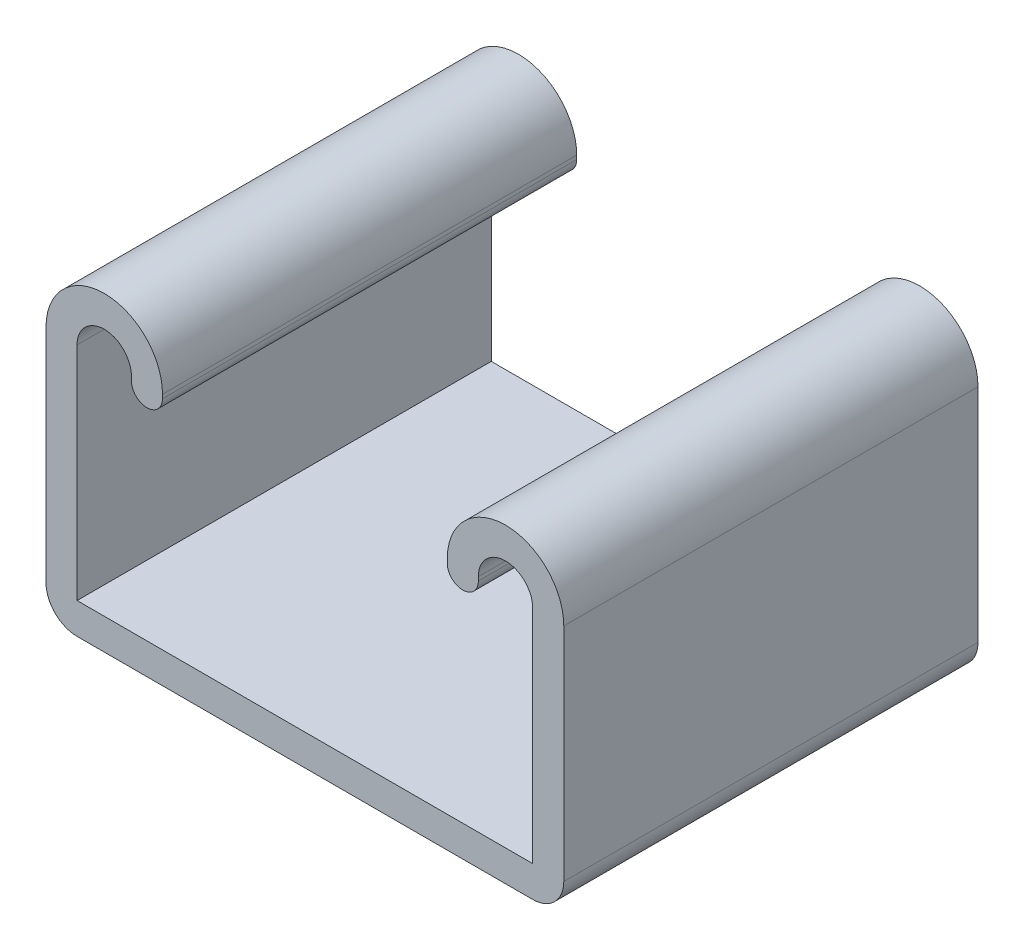
ISO-10303-21;
HEADER;
FILE_DESCRIPTION(('STEP AP214'),'2;1');
FILE_NAME('part.step','',(''),(''),'','','');
FILE_SCHEMA(('AUTOMOTIVE_DESIGN { 1 0 10303 214 1 1 1 1 }'));
ENDSEC;
DATA;
#1=APPLICATION_CONTEXT('core data for automotive mechanical design processes');
#2=APPLICATION_PROTOCOL_DEFINITION('international standard','automotive_design',2000,#1);
#3=PRODUCT_CONTEXT('',#1,'mechanical');
#4=PRODUCT('Part','Part','',(#3));
#5=PRODUCT_RELATED_PRODUCT_CATEGORY('part','',(#4));
#6=PRODUCT_DEFINITION_FORMATION('','',#4);
#7=PRODUCT_DEFINITION_CONTEXT('part definition',#1,'design');
#8=PRODUCT_DEFINITION('design','',#6,#7);
#9=PRODUCT_DEFINITION_SHAPE('','',#8);
#10=(LENGTH_UNIT() NAMED_UNIT(*) SI_UNIT(.MILLI.,.METRE.));
#11=(NAMED_UNIT(*) PLANE_ANGLE_UNIT() SI_UNIT($,.RADIAN.));
#12=(NAMED_UNIT(*) SI_UNIT($,.STERADIAN.) SOLID_ANGLE_UNIT());
#13=UNCERTAINTY_MEASURE_WITH_UNIT(LENGTH_MEASURE(1.E-05),#10,'distance_accuracy_value','');
#14=(GEOMETRIC_REPRESENTATION_CONTEXT(3) GLOBAL_UNCERTAINTY_ASSIGNED_CONTEXT((#13)) GLOBAL_UNIT_ASSIGNED_CONTEXT((#10,
#11,#12)) REPRESENTATION_CONTEXT('',''));
#15=CARTESIAN_POINT('',(0.,0.,0.));
#16=DIRECTION('',(0.,0.,1.));
#17=DIRECTION('',(1.,0.,0.));
#18=AXIS2_PLACEMENT_3D('',#15,#16,#17);
#19=CARTESIAN_POINT('',(-12.303125,7.604125,12.7));
#20=DIRECTION('',(0.,0.,-1.));
#21=DIRECTION('',(-1.,0.,0.));
#22=AXIS2_PLACEMENT_3D('',#19,#20,#21);
#23=CYLINDRICAL_SURFACE('',#22,3.571875);
#24=CARTESIAN_POINT('',(-12.303125,7.604125,-12.7));
#25=DIRECTION('',(0.,0.,1.));
#26=DIRECTION('',(-1.,0.,0.));
#27=AXIS2_PLACEMENT_3D('',#24,#25,#26);
#28=CIRCLE('',#27,3.571875);
#29=CARTESIAN_POINT('',(-8.73125,7.604125,-12.7));
#30=VERTEX_POINT('',#29);
#31=CARTESIAN_POINT('',(-15.875,7.604125,-12.7));
#32=VERTEX_POINT('',#31);
#33=EDGE_CURVE('E188',#30,#32,#28,.T.);
#34=ORIENTED_EDGE('',*,*,#33,.T.);
#35=DIRECTION('',(0.,0.,-1.));
#36=VECTOR('',#35,1.);
#37=CARTESIAN_POINT('',(-15.875,7.604125,12.7));
#38=LINE('',#37,#36);
#39=CARTESIAN_POINT('',(-15.875,7.604125,12.7));
#40=VERTEX_POINT('',#39);
#41=EDGE_CURVE('E11',#40,#32,#38,.T.);
#42=ORIENTED_EDGE('',*,*,#41,.F.);
#43=CARTESIAN_POINT('',(-12.303125,7.604125,12.7));
#44=DIRECTION('',(0.,0.,1.));
#45=DIRECTION('',(-1.,0.,0.));
#46=AXIS2_PLACEMENT_3D('',#43,#44,#45);
#47=CIRCLE('',#46,3.571875);
#48=CARTESIAN_POINT('',(-8.73125,7.604125,12.7));
#49=VERTEX_POINT('',#48);
#50=EDGE_CURVE('E222',#49,#40,#47,.T.);
#51=ORIENTED_EDGE('',*,*,#50,.F.);
#52=DIRECTION('',(0.,0.,-1.));
#53=VECTOR('',#52,1.);
#54=CARTESIAN_POINT('',(-8.73125,7.604125,12.7));
#55=LINE('',#54,#53);
#56=EDGE_CURVE('E184',#49,#30,#55,.T.);
#57=ORIENTED_EDGE('',*,*,#56,.T.);
#58=EDGE_LOOP('',(#34,#42,#51,#57));
#59=FACE_BOUND('',#58,.T.);
#60=ADVANCED_FACE('F32',(#59),#23,.T.);
#61=CARTESIAN_POINT('',(-15.875,7.604125,12.7));
#62=DIRECTION('',(1.,0.,0.));
#63=DIRECTION('',(0.,0.,-1.));
#64=AXIS2_PLACEMENT_3D('',#61,#62,#63);
#65=PLANE('',#64);
#66=DIRECTION('',(0.,-1.,0.));
#67=VECTOR('',#66,1.);
#68=CARTESIAN_POINT('',(-15.875,7.604125,-12.7));
#69=LINE('',#68,#67);
#70=CARTESIAN_POINT('',(-15.875,-5.969,-12.7));
#71=VERTEX_POINT('',#70);
#72=EDGE_CURVE('E191',#32,#71,#69,.T.);
#73=ORIENTED_EDGE('',*,*,#72,.T.);
#74=DIRECTION('',(0.,0.,-1.));
#75=VECTOR('',#74,1.);
#76=CARTESIAN_POINT('',(-15.875,-5.969,12.7));
#77=LINE('',#76,#75);
#78=CARTESIAN_POINT('',(-15.875,-5.969,12.7));
#79=VERTEX_POINT('',#78);
#80=EDGE_CURVE('E40',#79,#71,#77,.T.);
#81=ORIENTED_EDGE('',*,*,#80,.F.);
#82=DIRECTION('',(0.,-1.,0.));
#83=VECTOR('',#82,1.);
#84=CARTESIAN_POINT('',(-15.875,7.604125,12.7));
#85=LINE('',#84,#83);
#86=EDGE_CURVE('E121',#40,#79,#85,.T.);
#87=ORIENTED_EDGE('',*,*,#86,.F.);
#88=ORIENTED_EDGE('',*,*,#41,.T.);
#89=EDGE_LOOP('',(#73,#81,#87,#88));
#90=FACE_BOUND('',#89,.T.);
#91=ADVANCED_FACE('F330',(#90),#65,.F.);
#92=CARTESIAN_POINT('',(-13.97,-5.969,12.7));
#93=DIRECTION('',(0.,0.,-1.));
#94=DIRECTION('',(-1.,0.,0.));
#95=AXIS2_PLACEMENT_3D('',#92,#93,#94);
#96=CYLINDRICAL_SURFACE('',#95,1.905);
#97=CARTESIAN_POINT('',(-13.97,-5.969,-12.7));
#98=DIRECTION('',(0.,0.,1.));
#99=DIRECTION('',(-1.,0.,0.));
#100=AXIS2_PLACEMENT_3D('',#97,#98,#99);
#101=CIRCLE('',#100,1.905);
#102=CARTESIAN_POINT('',(-13.97,-7.874,-12.7));
#103=VERTEX_POINT('',#102);
#104=EDGE_CURVE('E193',#71,#103,#101,.T.);
#105=ORIENTED_EDGE('',*,*,#104,.T.);
#106=DIRECTION('',(0.,0.,-1.));
#107=VECTOR('',#106,1.);
#108=CARTESIAN_POINT('',(-13.97,-7.874,12.7));
#109=LINE('',#108,#107);
#110=CARTESIAN_POINT('',(-13.97,-7.874,12.7));
#111=VERTEX_POINT('',#110);
#112=EDGE_CURVE('E259',#111,#103,#109,.T.);
#113=ORIENTED_EDGE('',*,*,#112,.F.);
#114=CARTESIAN_POINT('',(-13.97,-5.969,12.7));
#115=DIRECTION('',(0.,0.,1.));
#116=DIRECTION('',(-1.,0.,0.));
#117=AXIS2_PLACEMENT_3D('',#114,#115,#116);
#118=CIRCLE('',#117,1.905);
#119=EDGE_CURVE('E267',#79,#111,#118,.T.);
#120=ORIENTED_EDGE('',*,*,#119,.F.);
#121=ORIENTED_EDGE('',*,*,#80,.T.);
#122=EDGE_LOOP('',(#105,#113,#120,#121));
#123=FACE_BOUND('',#122,.T.);
#124=ADVANCED_FACE('F265',(#123),#96,.T.);
#125=CARTESIAN_POINT('',(-13.97,-7.874,12.7));
#126=DIRECTION('',(0.,1.,0.));
#127=DIRECTION('',(0.,0.,1.));
#128=AXIS2_PLACEMENT_3D('',#125,#126,#127);
#129=PLANE('',#128);
#130=DIRECTION('',(1.,0.,0.));
#131=VECTOR('',#130,1.);
#132=CARTESIAN_POINT('',(-13.97,-7.874,-12.7));
#133=LINE('',#132,#131);
#134=CARTESIAN_POINT('',(13.97,-7.874,-12.7));
#135=VERTEX_POINT('',#134);
#136=EDGE_CURVE('E195',#103,#135,#133,.T.);
#137=ORIENTED_EDGE('',*,*,#136,.T.);
#138=DIRECTION('',(0.,0.,-1.));
#139=VECTOR('',#138,1.);
#140=CARTESIAN_POINT('',(13.97,-7.874,12.7));
#141=LINE('',#140,#139);
#142=CARTESIAN_POINT('',(13.97,-7.874,12.7));
#143=VERTEX_POINT('',#142);
#144=EDGE_CURVE('E256',#143,#135,#141,.T.);
#145=ORIENTED_EDGE('',*,*,#144,.F.);
#146=DIRECTION('',(1.,0.,0.));
#147=VECTOR('',#146,1.);
#148=CARTESIAN_POINT('',(-13.97,-7.874,12.7));
#149=LINE('',#148,#147);
#150=EDGE_CURVE('E285',#111,#143,#149,.T.);
#151=ORIENTED_EDGE('',*,*,#150,.F.);
#152=ORIENTED_EDGE('',*,*,#112,.T.);
#153=EDGE_LOOP('',(#137,#145,#151,#152));
#154=FACE_BOUND('',#153,.T.);
#155=ADVANCED_FACE('F276',(#154),#129,.F.);
#156=CARTESIAN_POINT('',(13.97,-5.969,12.7));
#157=DIRECTION('',(0.,0.,-1.));
#158=DIRECTION('',(-1.,0.,0.));
#159=AXIS2_PLACEMENT_3D('',#156,#157,#158);
#160=CYLINDRICAL_SURFACE('',#159,1.905);
#161=CARTESIAN_POINT('',(13.97,-5.969,-12.7));
#162=DIRECTION('',(0.,0.,1.));
#163=DIRECTION('',(1.,0.,0.));
#164=AXIS2_PLACEMENT_3D('',#161,#162,#163);
#165=CIRCLE('',#164,1.905);
#166=CARTESIAN_POINT('',(15.875,-5.969,-12.7));
#167=VERTEX_POINT('',#166);
#168=EDGE_CURVE('E197',#135,#167,#165,.T.);
#169=ORIENTED_EDGE('',*,*,#168,.T.);
#170=DIRECTION('',(0.,0.,-1.));
#171=VECTOR('',#170,1.);
#172=CARTESIAN_POINT('',(15.875,-5.969,12.7));
#173=LINE('',#172,#171);
#174=CARTESIAN_POINT('',(15.875,-5.969,12.7));
#175=VERTEX_POINT('',#174);
#176=EDGE_CURVE('E253',#175,#167,#173,.T.);
#177=ORIENTED_EDGE('',*,*,#176,.F.);
#178=CARTESIAN_POINT('',(13.97,-5.969,12.7));
#179=DIRECTION('',(0.,0.,1.));
#180=DIRECTION('',(1.,0.,0.));
#181=AXIS2_PLACEMENT_3D('',#178,#179,#180);
#182=CIRCLE('',#181,1.905);
#183=EDGE_CURVE('E282',#143,#175,#182,.T.);
#184=ORIENTED_EDGE('',*,*,#183,.F.);
#185=ORIENTED_EDGE('',*,*,#144,.T.);
#186=EDGE_LOOP('',(#169,#177,#184,#185));
#187=FACE_BOUND('',#186,.T.);
#188=ADVANCED_FACE('F280',(#187),#160,.T.);
#189=CARTESIAN_POINT('',(15.875,-5.969,12.7));
#190=DIRECTION('',(-1.,0.,0.));
#191=DIRECTION('',(0.,-1.,0.));
#192=AXIS2_PLACEMENT_3D('',#189,#190,#191);
#193=PLANE('',#192);
#194=DIRECTION('',(0.,1.,0.));
#195=VECTOR('',#194,1.);
#196=CARTESIAN_POINT('',(15.875,-5.969,-12.7));
#197=LINE('',#196,#195);
#198=CARTESIAN_POINT('',(15.875,7.604125,-12.7));
#199=VERTEX_POINT('',#198);
#200=EDGE_CURVE('E199',#167,#199,#197,.T.);
#201=ORIENTED_EDGE('',*,*,#200,.T.);
#202=DIRECTION('',(0.,0.,-1.));
#203=VECTOR('',#202,1.);
#204=CARTESIAN_POINT('',(15.875,7.604125,12.7));
#205=LINE('',#204,#203);
#206=CARTESIAN_POINT('',(15.875,7.604125,12.7));
#207=VERTEX_POINT('',#206);
#208=EDGE_CURVE('E250',#207,#199,#205,.T.);
#209=ORIENTED_EDGE('',*,*,#208,.F.);
#210=DIRECTION('',(0.,1.,0.));
#211=VECTOR('',#210,1.);
#212=CARTESIAN_POINT('',(15.875,-5.969,12.7));
#213=LINE('',#212,#211);
#214=EDGE_CURVE('E284',#175,#207,#213,.T.);
#215=ORIENTED_EDGE('',*,*,#214,.F.);
#216=ORIENTED_EDGE('',*,*,#176,.T.);
#217=EDGE_LOOP('',(#201,#209,#215,#216));
#218=FACE_BOUND('',#217,.T.);
#219=ADVANCED_FACE('F343',(#218),#193,.F.);
#220=CARTESIAN_POINT('',(12.303125,7.604125,12.7));
#221=DIRECTION('',(0.,0.,-1.));
#222=DIRECTION('',(-1.,0.,0.));
#223=AXIS2_PLACEMENT_3D('',#220,#221,#222);
#224=CYLINDRICAL_SURFACE('',#223,3.571875);
#225=CARTESIAN_POINT('',(12.303125,7.604125,-12.7));
#226=DIRECTION('',(0.,0.,1.));
#227=DIRECTION('',(1.,0.,0.));
#228=AXIS2_PLACEMENT_3D('',#225,#226,#227);
#229=CIRCLE('',#228,3.571875);
#230=CARTESIAN_POINT('',(8.73125,7.604125,-12.7));
#231=VERTEX_POINT('',#230);
#232=EDGE_CURVE('E201',#199,#231,#229,.T.);
#233=ORIENTED_EDGE('',*,*,#232,.T.);
#234=DIRECTION('',(0.,0.,-1.));
#235=VECTOR('',#234,1.);
#236=CARTESIAN_POINT('',(8.73125,7.604125,12.7));
#237=LINE('',#236,#235);
#238=CARTESIAN_POINT('',(8.73125,7.604125,12.7));
#239=VERTEX_POINT('',#238);
#240=EDGE_CURVE('E247',#239,#231,#237,.T.);
#241=ORIENTED_EDGE('',*,*,#240,.F.);
#242=CARTESIAN_POINT('',(12.303125,7.604125,12.7));
#243=DIRECTION('',(0.,0.,1.));
#244=DIRECTION('',(1.,0.,0.));
#245=AXIS2_PLACEMENT_3D('',#242,#243,#244);
#246=CIRCLE('',#245,3.571875);
#247=EDGE_CURVE('E287',#207,#239,#246,.T.);
#248=ORIENTED_EDGE('',*,*,#247,.F.);
#249=ORIENTED_EDGE('',*,*,#208,.T.);
#250=EDGE_LOOP('',(#233,#241,#248,#249));
#251=FACE_BOUND('',#250,.T.);
#252=ADVANCED_FACE('F346',(#251),#224,.T.);
#253=CARTESIAN_POINT('',(8.73125,7.604125,12.7));
#254=DIRECTION('',(1.,0.,0.));
#255=DIRECTION('',(0.,0.,-1.));
#256=AXIS2_PLACEMENT_3D('',#253,#254,#255);
#257=PLANE('',#256);
#258=DIRECTION('',(0.,-1.,0.));
#259=VECTOR('',#258,1.);
#260=CARTESIAN_POINT('',(8.73125,7.604125,-12.7));
#261=LINE('',#260,#259);
#262=CARTESIAN_POINT('',(8.73125,7.366,-12.7));
#263=VERTEX_POINT('',#262);
#264=EDGE_CURVE('E203',#231,#263,#261,.T.);
#265=ORIENTED_EDGE('',*,*,#264,.T.);
#266=DIRECTION('',(0.,0.,-1.));
#267=VECTOR('',#266,1.);
#268=CARTESIAN_POINT('',(8.73125,7.366,12.7));
#269=LINE('',#268,#267);
#270=CARTESIAN_POINT('',(8.73125,7.366,12.7));
#271=VERTEX_POINT('',#270);
#272=EDGE_CURVE('E244',#271,#263,#269,.T.);
#273=ORIENTED_EDGE('',*,*,#272,.F.);
#274=DIRECTION('',(0.,-1.,0.));
#275=VECTOR('',#274,1.);
#276=CARTESIAN_POINT('',(8.73125,7.604125,12.7));
#277=LINE('',#276,#275);
#278=EDGE_CURVE('E293',#239,#271,#277,.T.);
#279=ORIENTED_EDGE('',*,*,#278,.F.);
#280=ORIENTED_EDGE('',*,*,#240,.T.);
#281=EDGE_LOOP('',(#265,#273,#279,#280));
#282=FACE_BOUND('',#281,.T.);
#283=ADVANCED_FACE('F350',(#282),#257,.F.);
#284=CARTESIAN_POINT('',(9.68375,7.366,12.7));
#285=DIRECTION('',(0.,0.,-1.));
#286=DIRECTION('',(-1.,0.,0.));
#287=AXIS2_PLACEMENT_3D('',#284,#285,#286);
#288=CYLINDRICAL_SURFACE('',#287,0.9525);
#289=CARTESIAN_POINT('',(9.68375,7.366,-12.7));
#290=DIRECTION('',(0.,0.,1.));
#291=DIRECTION('',(1.,0.,0.));
#292=AXIS2_PLACEMENT_3D('',#289,#290,#291);
#293=CIRCLE('',#292,0.9525);
#294=CARTESIAN_POINT('',(10.63625,7.366,-12.7));
#295=VERTEX_POINT('',#294);
#296=EDGE_CURVE('E205',#263,#295,#293,.T.);
#297=ORIENTED_EDGE('',*,*,#296,.T.);
#298=DIRECTION('',(0.,0.,-1.));
#299=VECTOR('',#298,1.);
#300=CARTESIAN_POINT('',(10.63625,7.366,12.7));
#301=LINE('',#300,#299);
#302=CARTESIAN_POINT('',(10.63625,7.366,12.7));
#303=VERTEX_POINT('',#302);
#304=EDGE_CURVE('E241',#303,#295,#301,.T.);
#305=ORIENTED_EDGE('',*,*,#304,.F.);
#306=CARTESIAN_POINT('',(9.68375,7.366,12.7));
#307=DIRECTION('',(0.,0.,1.));
#308=DIRECTION('',(1.,0.,0.));
#309=AXIS2_PLACEMENT_3D('',#306,#307,#308);
#310=CIRCLE('',#309,0.9525);
#311=EDGE_CURVE('E295',#271,#303,#310,.T.);
#312=ORIENTED_EDGE('',*,*,#311,.F.);
#313=ORIENTED_EDGE('',*,*,#272,.T.);
#314=EDGE_LOOP('',(#297,#305,#312,#313));
#315=FACE_BOUND('',#314,.T.);
#316=ADVANCED_FACE('F354',(#315),#288,.T.);
#317=CARTESIAN_POINT('',(10.63625,7.604125,12.7));
#318=DIRECTION('',(-1.,0.,0.));
#319=DIRECTION('',(0.,0.,1.));
#320=AXIS2_PLACEMENT_3D('',#317,#318,#319);
#321=PLANE('',#320);
#322=DIRECTION('',(0.,1.,0.));
#323=VECTOR('',#322,1.);
#324=CARTESIAN_POINT('',(10.63625,7.604125,-12.7));
#325=LINE('',#324,#323);
#326=CARTESIAN_POINT('',(10.63625,7.604125,-12.7));
#327=VERTEX_POINT('',#326);
#328=EDGE_CURVE('E207',#295,#327,#325,.T.);
#329=ORIENTED_EDGE('',*,*,#328,.T.);
#330=DIRECTION('',(0.,0.,-1.));
#331=VECTOR('',#330,1.);
#332=CARTESIAN_POINT('',(10.63625,7.604125,12.7));
#333=LINE('',#332,#331);
#334=CARTESIAN_POINT('',(10.63625,7.604125,12.7));
#335=VERTEX_POINT('',#334);
#336=EDGE_CURVE('E238',#335,#327,#333,.T.);
#337=ORIENTED_EDGE('',*,*,#336,.F.);
#338=DIRECTION('',(0.,1.,0.));
#339=VECTOR('',#338,1.);
#340=CARTESIAN_POINT('',(10.63625,7.604125,12.7));
#341=LINE('',#340,#339);
#342=EDGE_CURVE('E297',#303,#335,#341,.T.);
#343=ORIENTED_EDGE('',*,*,#342,.F.);
#344=ORIENTED_EDGE('',*,*,#304,.T.);
#345=EDGE_LOOP('',(#329,#337,#343,#344));
#346=FACE_BOUND('',#345,.T.);
#347=ADVANCED_FACE('F358',(#346),#321,.F.);
#348=CARTESIAN_POINT('',(12.303125,7.604125,12.7));
#349=DIRECTION('',(0.,0.,-1.));
#350=DIRECTION('',(-1.,0.,0.));
#351=AXIS2_PLACEMENT_3D('',#348,#349,#350);
#352=CYLINDRICAL_SURFACE('',#351,1.666875);
#353=CARTESIAN_POINT('',(12.303125,7.604125,-12.7));
#354=DIRECTION('',(0.,0.,-1.));
#355=DIRECTION('',(1.,0.,0.));
#356=AXIS2_PLACEMENT_3D('',#353,#354,#355);
#357=CIRCLE('',#356,1.666875);
#358=CARTESIAN_POINT('',(13.97,7.604125,-12.7));
#359=VERTEX_POINT('',#358);
#360=EDGE_CURVE('E209',#327,#359,#357,.T.);
#361=ORIENTED_EDGE('',*,*,#360,.T.);
#362=DIRECTION('',(0.,0.,-1.));
#363=VECTOR('',#362,1.);
#364=CARTESIAN_POINT('',(13.97,7.604125,12.7));
#365=LINE('',#364,#363);
#366=CARTESIAN_POINT('',(13.97,7.604125,12.7));
#367=VERTEX_POINT('',#366);
#368=EDGE_CURVE('E235',#367,#359,#365,.T.);
#369=ORIENTED_EDGE('',*,*,#368,.F.);
#370=CARTESIAN_POINT('',(12.303125,7.604125,12.7));
#371=DIRECTION('',(0.,0.,-1.));
#372=DIRECTION('',(1.,0.,0.));
#373=AXIS2_PLACEMENT_3D('',#370,#371,#372);
#374=CIRCLE('',#373,1.666875);
#375=EDGE_CURVE('E299',#335,#367,#374,.T.);
#376=ORIENTED_EDGE('',*,*,#375,.F.);
#377=ORIENTED_EDGE('',*,*,#336,.T.);
#378=EDGE_LOOP('',(#361,#369,#376,#377));
#379=FACE_BOUND('',#378,.T.);
#380=ADVANCED_FACE('F362',(#379),#352,.F.);
#381=CARTESIAN_POINT('',(13.97,-5.969,12.7));
#382=DIRECTION('',(1.,0.,0.));
#383=DIRECTION('',(0.,1.,0.));
#384=AXIS2_PLACEMENT_3D('',#381,#382,#383);
#385=PLANE('',#384);
#386=DIRECTION('',(0.,-1.,0.));
#387=VECTOR('',#386,1.);
#388=CARTESIAN_POINT('',(13.97,-5.969,-12.7));
#389=LINE('',#388,#387);
#390=CARTESIAN_POINT('',(13.97,-5.969,-12.7));
#391=VERTEX_POINT('',#390);
#392=EDGE_CURVE('E211',#359,#391,#389,.T.);
#393=ORIENTED_EDGE('',*,*,#392,.T.);
#394=DIRECTION('',(0.,0.,-1.));
#395=VECTOR('',#394,1.);
#396=CARTESIAN_POINT('',(13.97,-5.969,12.7));
#397=LINE('',#396,#395);
#398=CARTESIAN_POINT('',(13.97,-5.969,12.7));
#399=VERTEX_POINT('',#398);
#400=EDGE_CURVE('E232',#399,#391,#397,.T.);
#401=ORIENTED_EDGE('',*,*,#400,.F.);
#402=DIRECTION('',(0.,-1.,0.));
#403=VECTOR('',#402,1.);
#404=CARTESIAN_POINT('',(13.97,-5.969,12.7));
#405=LINE('',#404,#403);
#406=EDGE_CURVE('E301',#367,#399,#405,.T.);
#407=ORIENTED_EDGE('',*,*,#406,.F.);
#408=ORIENTED_EDGE('',*,*,#368,.T.);
#409=EDGE_LOOP('',(#393,#401,#407,#408));
#410=FACE_BOUND('',#409,.T.);
#411=ADVANCED_FACE('F366',(#410),#385,.F.);
#412=CARTESIAN_POINT('',(-13.97,-5.969,12.7));
#413=DIRECTION('',(0.,-1.,0.));
#414=DIRECTION('',(0.,0.,-1.));
#415=AXIS2_PLACEMENT_3D('',#412,#413,#414);
#416=PLANE('',#415);
#417=DIRECTION('',(-1.,0.,0.));
#418=VECTOR('',#417,1.);
#419=CARTESIAN_POINT('',(-13.97,-5.969,-12.7));
#420=LINE('',#419,#418);
#421=CARTESIAN_POINT('',(-13.97,-5.969,-12.7));
#422=VERTEX_POINT('',#421);
#423=EDGE_CURVE('E213',#391,#422,#420,.T.);
#424=ORIENTED_EDGE('',*,*,#423,.T.);
#425=DIRECTION('',(0.,0.,-1.));
#426=VECTOR('',#425,1.);
#427=CARTESIAN_POINT('',(-13.97,-5.969,12.7));
#428=LINE('',#427,#426);
#429=CARTESIAN_POINT('',(-13.97,-5.969,12.7));
#430=VERTEX_POINT('',#429);
#431=EDGE_CURVE('E229',#430,#422,#428,.T.);
#432=ORIENTED_EDGE('',*,*,#431,.F.);
#433=DIRECTION('',(-1.,0.,0.));
#434=VECTOR('',#433,1.);
#435=CARTESIAN_POINT('',(-13.97,-5.969,12.7));
#436=LINE('',#435,#434);
#437=EDGE_CURVE('E303',#399,#430,#436,.T.);
#438=ORIENTED_EDGE('',*,*,#437,.F.);
#439=ORIENTED_EDGE('',*,*,#400,.T.);
#440=EDGE_LOOP('',(#424,#432,#438,#439));
#441=FACE_BOUND('',#440,.T.);
#442=ADVANCED_FACE('F370',(#441),#416,.F.);
#443=CARTESIAN_POINT('',(-13.97,7.604125,12.7));
#444=DIRECTION('',(-1.,0.,0.));
#445=DIRECTION('',(0.,-1.,0.));
#446=AXIS2_PLACEMENT_3D('',#443,#444,#445);
#447=PLANE('',#446);
#448=DIRECTION('',(0.,1.,0.));
#449=VECTOR('',#448,1.);
#450=CARTESIAN_POINT('',(-13.97,7.604125,-12.7));
#451=LINE('',#450,#449);
#452=CARTESIAN_POINT('',(-13.97,7.604125,-12.7));
#453=VERTEX_POINT('',#452);
#454=EDGE_CURVE('E215',#422,#453,#451,.T.);
#455=ORIENTED_EDGE('',*,*,#454,.T.);
#456=DIRECTION('',(0.,0.,-1.));
#457=VECTOR('',#456,1.);
#458=CARTESIAN_POINT('',(-13.97,7.604125,12.7));
#459=LINE('',#458,#457);
#460=CARTESIAN_POINT('',(-13.97,7.604125,12.7));
#461=VERTEX_POINT('',#460);
#462=EDGE_CURVE('E226',#461,#453,#459,.T.);
#463=ORIENTED_EDGE('',*,*,#462,.F.);
#464=DIRECTION('',(0.,1.,0.));
#465=VECTOR('',#464,1.);
#466=CARTESIAN_POINT('',(-13.97,7.604125,12.7));
#467=LINE('',#466,#465);
#468=EDGE_CURVE('E305',#430,#461,#467,.T.);
#469=ORIENTED_EDGE('',*,*,#468,.F.);
#470=ORIENTED_EDGE('',*,*,#431,.T.);
#471=EDGE_LOOP('',(#455,#463,#469,#470));
#472=FACE_BOUND('',#471,.T.);
#473=ADVANCED_FACE('F311',(#472),#447,.F.);
#474=CARTESIAN_POINT('',(-12.303125,7.604125,12.7));
#475=DIRECTION('',(0.,0.,-1.));
#476=DIRECTION('',(-1.,0.,0.));
#477=AXIS2_PLACEMENT_3D('',#474,#475,#476);
#478=CYLINDRICAL_SURFACE('',#477,1.666875);
#479=CARTESIAN_POINT('',(-12.303125,7.604125,-12.7));
#480=DIRECTION('',(0.,0.,-1.));
#481=DIRECTION('',(-1.,0.,0.));
#482=AXIS2_PLACEMENT_3D('',#479,#480,#481);
#483=CIRCLE('',#482,1.666875);
#484=CARTESIAN_POINT('',(-10.63625,7.604125,-12.7));
#485=VERTEX_POINT('',#484);
#486=EDGE_CURVE('E217',#453,#485,#483,.T.);
#487=ORIENTED_EDGE('',*,*,#486,.T.);
#488=DIRECTION('',(0.,0.,-1.));
#489=VECTOR('',#488,1.);
#490=CARTESIAN_POINT('',(-10.63625,7.604125,12.7));
#491=LINE('',#490,#489);
#492=CARTESIAN_POINT('',(-10.63625,7.604125,12.7));
#493=VERTEX_POINT('',#492);
#494=EDGE_CURVE('E179',#493,#485,#491,.T.);
#495=ORIENTED_EDGE('',*,*,#494,.F.);
#496=CARTESIAN_POINT('',(-12.303125,7.604125,12.7));
#497=DIRECTION('',(0.,0.,-1.));
#498=DIRECTION('',(-1.,0.,0.));
#499=AXIS2_PLACEMENT_3D('',#496,#497,#498);
#500=CIRCLE('',#499,1.666875);
#501=EDGE_CURVE('E170',#461,#493,#500,.T.);
#502=ORIENTED_EDGE('',*,*,#501,.F.);
#503=ORIENTED_EDGE('',*,*,#462,.T.);
#504=EDGE_LOOP('',(#487,#495,#502,#503));
#505=FACE_BOUND('',#504,.T.);
#506=ADVANCED_FACE('F315',(#505),#478,.F.);
#507=CARTESIAN_POINT('',(-10.63625,7.604125,12.7));
#508=DIRECTION('',(1.,0.,0.));
#509=DIRECTION('',(0.,1.,0.));
#510=AXIS2_PLACEMENT_3D('',#507,#508,#509);
#511=PLANE('',#510);
#512=DIRECTION('',(0.,-1.,0.));
#513=VECTOR('',#512,1.);
#514=CARTESIAN_POINT('',(-10.63625,7.604125,-12.7));
#515=LINE('',#514,#513);
#516=CARTESIAN_POINT('',(-10.63625,7.366,-12.7));
#517=VERTEX_POINT('',#516);
#518=EDGE_CURVE('E178',#485,#517,#515,.T.);
#519=ORIENTED_EDGE('',*,*,#518,.T.);
#520=DIRECTION('',(0.,0.,-1.));
#521=VECTOR('',#520,1.);
#522=CARTESIAN_POINT('',(-10.63625,7.366,12.7));
#523=LINE('',#522,#521);
#524=CARTESIAN_POINT('',(-10.63625,7.366,12.7));
#525=VERTEX_POINT('',#524);
#526=EDGE_CURVE('E175',#525,#517,#523,.T.);
#527=ORIENTED_EDGE('',*,*,#526,.F.);
#528=DIRECTION('',(0.,-1.,0.));
#529=VECTOR('',#528,1.);
#530=CARTESIAN_POINT('',(-10.63625,7.604125,12.7));
#531=LINE('',#530,#529);
#532=EDGE_CURVE('E164',#493,#525,#531,.T.);
#533=ORIENTED_EDGE('',*,*,#532,.F.);
#534=ORIENTED_EDGE('',*,*,#494,.T.);
#535=EDGE_LOOP('',(#519,#527,#533,#534));
#536=FACE_BOUND('',#535,.T.);
#537=ADVANCED_FACE('F176',(#536),#511,.F.);
#538=CARTESIAN_POINT('',(-9.68375,7.366,12.7));
#539=DIRECTION('',(0.,0.,-1.));
#540=DIRECTION('',(-1.,0.,0.));
#541=AXIS2_PLACEMENT_3D('',#538,#539,#540);
#542=CYLINDRICAL_SURFACE('',#541,0.952500000000001);
#543=CARTESIAN_POINT('',(-9.68375,7.366,-12.7));
#544=DIRECTION('',(0.,0.,1.));
#545=DIRECTION('',(-1.,0.,0.));
#546=AXIS2_PLACEMENT_3D('',#543,#544,#545);
#547=CIRCLE('',#546,0.952500000000001);
#548=CARTESIAN_POINT('',(-8.73125,7.366,-12.7));
#549=VERTEX_POINT('',#548);
#550=EDGE_CURVE('E107',#517,#549,#547,.T.);
#551=ORIENTED_EDGE('',*,*,#550,.T.);
#552=DIRECTION('',(0.,0.,-1.));
#553=VECTOR('',#552,1.);
#554=CARTESIAN_POINT('',(-8.73125,7.366,12.7));
#555=LINE('',#554,#553);
#556=CARTESIAN_POINT('',(-8.73125,7.366,12.7));
#557=VERTEX_POINT('',#556);
#558=EDGE_CURVE('E180',#557,#549,#555,.T.);
#559=ORIENTED_EDGE('',*,*,#558,.F.);
#560=CARTESIAN_POINT('',(-9.68375,7.366,12.7));
#561=DIRECTION('',(0.,0.,1.));
#562=DIRECTION('',(-1.,0.,0.));
#563=AXIS2_PLACEMENT_3D('',#560,#561,#562);
#564=CIRCLE('',#563,0.952500000000001);
#565=EDGE_CURVE('E168',#525,#557,#564,.T.);
#566=ORIENTED_EDGE('',*,*,#565,.F.);
#567=ORIENTED_EDGE('',*,*,#526,.T.);
#568=EDGE_LOOP('',(#551,#559,#566,#567));
#569=FACE_BOUND('',#568,.T.);
#570=ADVANCED_FACE('F182',(#569),#542,.T.);
#571=CARTESIAN_POINT('',(-8.73125,7.604125,12.7));
#572=DIRECTION('',(-1.,0.,0.));
#573=DIRECTION('',(0.,-1.,0.));
#574=AXIS2_PLACEMENT_3D('',#571,#572,#573);
#575=PLANE('',#574);
#576=DIRECTION('',(0.,1.,0.));
#577=VECTOR('',#576,1.);
#578=CARTESIAN_POINT('',(-8.73125,7.604125,-12.7));
#579=LINE('',#578,#577);
#580=EDGE_CURVE('E113',#549,#30,#579,.T.);
#581=ORIENTED_EDGE('',*,*,#580,.T.);
#582=ORIENTED_EDGE('',*,*,#56,.F.);
#583=DIRECTION('',(0.,1.,0.));
#584=VECTOR('',#583,1.);
#585=CARTESIAN_POINT('',(-8.73125,7.604125,12.7));
#586=LINE('',#585,#584);
#587=EDGE_CURVE('E48',#557,#49,#586,.T.);
#588=ORIENTED_EDGE('',*,*,#587,.F.);
#589=ORIENTED_EDGE('',*,*,#558,.T.);
#590=EDGE_LOOP('',(#581,#582,#588,#589));
#591=FACE_BOUND('',#590,.T.);
#592=ADVANCED_FACE('F319',(#591),#575,.F.);
#593=CARTESIAN_POINT('',(-12.303125,7.604125,12.7));
#594=DIRECTION('',(0.,0.,-1.));
#595=DIRECTION('',(-1.,0.,0.));
#596=AXIS2_PLACEMENT_3D('',#593,#594,#595);
#597=PLANE('',#596);
#598=ORIENTED_EDGE('',*,*,#50,.T.);
#599=ORIENTED_EDGE('',*,*,#86,.T.);
#600=ORIENTED_EDGE('',*,*,#119,.T.);
#601=ORIENTED_EDGE('',*,*,#150,.T.);
#602=ORIENTED_EDGE('',*,*,#183,.T.);
#603=ORIENTED_EDGE('',*,*,#214,.T.);
#604=ORIENTED_EDGE('',*,*,#247,.T.);
#605=ORIENTED_EDGE('',*,*,#278,.T.);
#606=ORIENTED_EDGE('',*,*,#311,.T.);
#607=ORIENTED_EDGE('',*,*,#342,.T.);
#608=ORIENTED_EDGE('',*,*,#375,.T.);
#609=ORIENTED_EDGE('',*,*,#406,.T.);
#610=ORIENTED_EDGE('',*,*,#437,.T.);
#611=ORIENTED_EDGE('',*,*,#468,.T.);
#612=ORIENTED_EDGE('',*,*,#501,.T.);
#613=ORIENTED_EDGE('',*,*,#532,.T.);
#614=ORIENTED_EDGE('',*,*,#565,.T.);
#615=ORIENTED_EDGE('',*,*,#587,.T.);
#616=EDGE_LOOP('',(#598,#599,#600,#601,#602,#603,#604,#605,#606,#607,#608,#609,#610,#611,#612,
#613,#614,#615));
#617=FACE_BOUND('',#616,.T.);
#618=ADVANCED_FACE('F166',(#617),#597,.F.);
#619=CARTESIAN_POINT('',(-12.303125,7.604125,-12.7));
#620=DIRECTION('',(0.,0.,-1.));
#621=DIRECTION('',(-1.,0.,0.));
#622=AXIS2_PLACEMENT_3D('',#619,#620,#621);
#623=PLANE('',#622);
#624=ORIENTED_EDGE('',*,*,#33,.F.);
#625=ORIENTED_EDGE('',*,*,#580,.F.);
#626=ORIENTED_EDGE('',*,*,#550,.F.);
#627=ORIENTED_EDGE('',*,*,#518,.F.);
#628=ORIENTED_EDGE('',*,*,#486,.F.);
#629=ORIENTED_EDGE('',*,*,#454,.F.);
#630=ORIENTED_EDGE('',*,*,#423,.F.);
#631=ORIENTED_EDGE('',*,*,#392,.F.);
#632=ORIENTED_EDGE('',*,*,#360,.F.);
#633=ORIENTED_EDGE('',*,*,#328,.F.);
#634=ORIENTED_EDGE('',*,*,#296,.F.);
#635=ORIENTED_EDGE('',*,*,#264,.F.);
#636=ORIENTED_EDGE('',*,*,#232,.F.);
#637=ORIENTED_EDGE('',*,*,#200,.F.);
#638=ORIENTED_EDGE('',*,*,#168,.F.);
#639=ORIENTED_EDGE('',*,*,#136,.F.);
#640=ORIENTED_EDGE('',*,*,#104,.F.);
#641=ORIENTED_EDGE('',*,*,#72,.F.);
#642=EDGE_LOOP('',(#624,#625,#626,#627,#628,#629,#630,#631,#632,#633,#634,#635,#636,#637,#638,
#639,#640,#641));
#643=FACE_BOUND('',#642,.T.);
#644=ADVANCED_FACE('F271',(#643),#623,.T.);
#645=CLOSED_SHELL('',(#60,#91,#124,#155,#188,#219,#252,#283,#316,#347,#380,#411,#442,#473,#506,
#537,#570,#592,#618,#644));
#646=MANIFOLD_SOLID_BREP('B2',#645);
#647=ADVANCED_BREP_SHAPE_REPRESENTATION('',(#18,#646),#14);
#648=SHAPE_DEFINITION_REPRESENTATION(#9,#647);
ENDSEC;
END-ISO-10303-21;
